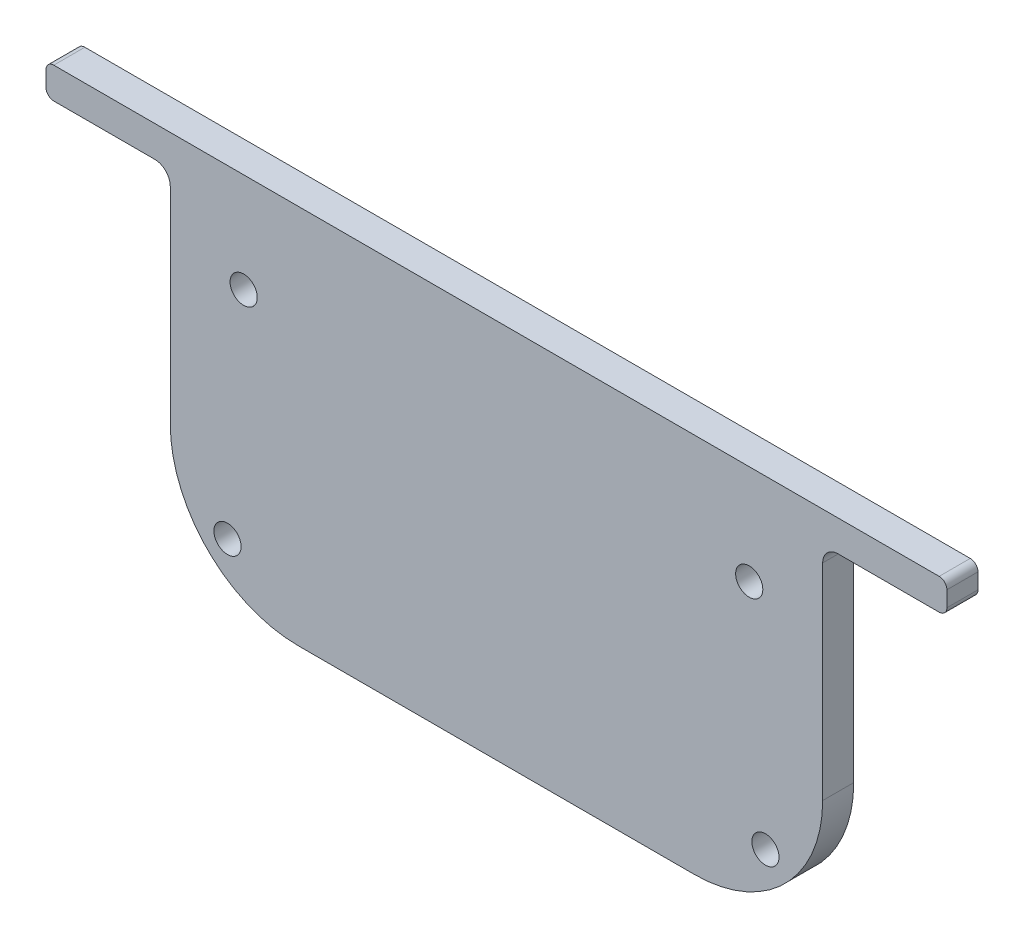
ISO-10303-21;
HEADER;
FILE_DESCRIPTION(('STEP AP214'),'2;1');
FILE_NAME('part.step','',(''),(''),'','','');
FILE_SCHEMA(('AUTOMOTIVE_DESIGN { 1 0 10303 214 1 1 1 1 }'));
ENDSEC;
DATA;
#1=APPLICATION_CONTEXT('core data for automotive mechanical design processes');
#2=APPLICATION_PROTOCOL_DEFINITION('international standard','automotive_design',2000,#1);
#3=PRODUCT_CONTEXT('',#1,'mechanical');
#4=PRODUCT('Part','Part','',(#3));
#5=PRODUCT_RELATED_PRODUCT_CATEGORY('part','',(#4));
#6=PRODUCT_DEFINITION_FORMATION('','',#4);
#7=PRODUCT_DEFINITION_CONTEXT('part definition',#1,'design');
#8=PRODUCT_DEFINITION('design','',#6,#7);
#9=PRODUCT_DEFINITION_SHAPE('','',#8);
#10=(LENGTH_UNIT() NAMED_UNIT(*) SI_UNIT(.MILLI.,.METRE.));
#11=(NAMED_UNIT(*) PLANE_ANGLE_UNIT() SI_UNIT($,.RADIAN.));
#12=(NAMED_UNIT(*) SI_UNIT($,.STERADIAN.) SOLID_ANGLE_UNIT());
#13=UNCERTAINTY_MEASURE_WITH_UNIT(LENGTH_MEASURE(1.E-05),#10,'distance_accuracy_value','');
#14=(GEOMETRIC_REPRESENTATION_CONTEXT(3) GLOBAL_UNCERTAINTY_ASSIGNED_CONTEXT((#13)) GLOBAL_UNIT_ASSIGNED_CONTEXT((#10,
#11,#12)) REPRESENTATION_CONTEXT('',''));
#15=CARTESIAN_POINT('',(0.,0.,0.));
#16=DIRECTION('',(0.,0.,1.));
#17=DIRECTION('',(1.,0.,0.));
#18=AXIS2_PLACEMENT_3D('',#15,#16,#17);
#19=CARTESIAN_POINT('',(165.580085469518,47.7956590481423,4.));
#20=DIRECTION('',(0.,0.,1.));
#21=DIRECTION('',(1.,0.,0.));
#22=AXIS2_PLACEMENT_3D('',#19,#20,#21);
#23=PLANE('',#22);
#24=CARTESIAN_POINT('',(154.122585469516,40.9879638935542,4.));
#25=DIRECTION('',(0.,0.,1.));
#26=DIRECTION('',(1.,0.,0.));
#27=AXIS2_PLACEMENT_3D('',#24,#25,#26);
#28=CIRCLE('',#27,1.75);
#29=CARTESIAN_POINT('',(155.872585469516,40.9879638935542,4.));
#30=VERTEX_POINT('',#29);
#31=EDGE_CURVE('E343',#30,#30,#28,.T.);
#32=ORIENTED_EDGE('',*,*,#31,.F.);
#33=EDGE_LOOP('',(#32));
#34=FACE_BOUND('',#33,.T.);
#35=CARTESIAN_POINT('',(89.0300854695157,40.9879638935542,4.));
#36=DIRECTION('',(0.,0.,1.));
#37=DIRECTION('',(1.,0.,0.));
#38=AXIS2_PLACEMENT_3D('',#35,#36,#37);
#39=CIRCLE('',#38,1.75);
#40=CARTESIAN_POINT('',(90.7800854695157,40.9879638935542,4.));
#41=VERTEX_POINT('',#40);
#42=EDGE_CURVE('E182',#41,#41,#39,.T.);
#43=ORIENTED_EDGE('',*,*,#42,.F.);
#44=EDGE_LOOP('',(#43));
#45=FACE_BOUND('',#44,.T.);
#46=CARTESIAN_POINT('',(165.580085469518,47.7956590481423,4.));
#47=DIRECTION('',(0.,0.,-1.));
#48=DIRECTION('',(1.,0.,0.));
#49=AXIS2_PLACEMENT_3D('',#46,#47,#48);
#50=CIRCLE('',#49,2.);
#51=CARTESIAN_POINT('',(163.580085469518,47.7956590481423,4.));
#52=VERTEX_POINT('',#51);
#53=CARTESIAN_POINT('',(165.580085469518,49.7956590481423,4.));
#54=VERTEX_POINT('',#53);
#55=EDGE_CURVE('E209',#52,#54,#50,.T.);
#56=ORIENTED_EDGE('',*,*,#55,.T.);
#57=DIRECTION('',(1.,0.,0.));
#58=VECTOR('',#57,1.);
#59=CARTESIAN_POINT('',(165.580085469518,49.7956590481423,4.));
#60=LINE('',#59,#58);
#61=CARTESIAN_POINT('',(178.580085469518,49.7956590481423,4.));
#62=VERTEX_POINT('',#61);
#63=EDGE_CURVE('E117',#54,#62,#60,.T.);
#64=ORIENTED_EDGE('',*,*,#63,.T.);
#65=CARTESIAN_POINT('',(178.580085469518,50.7956590481423,4.));
#66=DIRECTION('',(0.,0.,1.));
#67=DIRECTION('',(1.,0.,0.));
#68=AXIS2_PLACEMENT_3D('',#65,#66,#67);
#69=CIRCLE('',#68,1.);
#70=CARTESIAN_POINT('',(179.580085469518,50.7956590481423,4.));
#71=VERTEX_POINT('',#70);
#72=EDGE_CURVE('E248',#62,#71,#69,.T.);
#73=ORIENTED_EDGE('',*,*,#72,.T.);
#74=DIRECTION('',(0.,1.,0.));
#75=VECTOR('',#74,1.);
#76=CARTESIAN_POINT('',(179.580085469518,50.7956590481423,4.));
#77=LINE('',#76,#75);
#78=CARTESIAN_POINT('',(179.580085469518,52.7956590481423,4.));
#79=VERTEX_POINT('',#78);
#80=EDGE_CURVE('E267',#71,#79,#77,.T.);
#81=ORIENTED_EDGE('',*,*,#80,.T.);
#82=CARTESIAN_POINT('',(178.580085469518,52.7956590481423,4.));
#83=DIRECTION('',(0.,0.,1.));
#84=DIRECTION('',(1.,0.,0.));
#85=AXIS2_PLACEMENT_3D('',#82,#83,#84);
#86=CIRCLE('',#85,1.);
#87=CARTESIAN_POINT('',(178.580085469518,53.7956590481423,4.));
#88=VERTEX_POINT('',#87);
#89=EDGE_CURVE('E264',#79,#88,#86,.T.);
#90=ORIENTED_EDGE('',*,*,#89,.T.);
#91=DIRECTION('',(-1.,0.,0.));
#92=VECTOR('',#91,1.);
#93=CARTESIAN_POINT('',(178.580085469518,53.7956590481423,4.));
#94=LINE('',#93,#92);
#95=CARTESIAN_POINT('',(64.5800854695175,53.7956590481423,4.));
#96=VERTEX_POINT('',#95);
#97=EDGE_CURVE('E266',#88,#96,#94,.T.);
#98=ORIENTED_EDGE('',*,*,#97,.T.);
#99=CARTESIAN_POINT('',(64.5800854695175,52.7956590481423,4.));
#100=DIRECTION('',(0.,0.,1.));
#101=DIRECTION('',(1.,0.,0.));
#102=AXIS2_PLACEMENT_3D('',#99,#100,#101);
#103=CIRCLE('',#102,1.);
#104=CARTESIAN_POINT('',(63.5800854695175,52.7956590481423,4.));
#105=VERTEX_POINT('',#104);
#106=EDGE_CURVE('E269',#96,#105,#103,.T.);
#107=ORIENTED_EDGE('',*,*,#106,.T.);
#108=DIRECTION('',(0.,-1.,0.));
#109=VECTOR('',#108,1.);
#110=CARTESIAN_POINT('',(63.5800854695175,50.7956590481423,4.));
#111=LINE('',#110,#109);
#112=CARTESIAN_POINT('',(63.5800854695175,50.7956590481423,4.));
#113=VERTEX_POINT('',#112);
#114=EDGE_CURVE('E275',#105,#113,#111,.T.);
#115=ORIENTED_EDGE('',*,*,#114,.T.);
#116=CARTESIAN_POINT('',(64.5800854695175,50.7956590481423,4.));
#117=DIRECTION('',(0.,0.,1.));
#118=DIRECTION('',(1.,0.,0.));
#119=AXIS2_PLACEMENT_3D('',#116,#117,#118);
#120=CIRCLE('',#119,1.);
#121=CARTESIAN_POINT('',(64.5800854695175,49.7956590481423,4.));
#122=VERTEX_POINT('',#121);
#123=EDGE_CURVE('E277',#113,#122,#120,.T.);
#124=ORIENTED_EDGE('',*,*,#123,.T.);
#125=DIRECTION('',(1.,0.,0.));
#126=VECTOR('',#125,1.);
#127=CARTESIAN_POINT('',(77.5800854695175,49.7956590481423,4.));
#128=LINE('',#127,#126);
#129=CARTESIAN_POINT('',(77.5800854695175,49.7956590481423,4.));
#130=VERTEX_POINT('',#129);
#131=EDGE_CURVE('E279',#122,#130,#128,.T.);
#132=ORIENTED_EDGE('',*,*,#131,.T.);
#133=CARTESIAN_POINT('',(77.5800854695175,47.7956590481423,4.));
#134=DIRECTION('',(0.,0.,-1.));
#135=DIRECTION('',(1.,0.,0.));
#136=AXIS2_PLACEMENT_3D('',#133,#134,#135);
#137=CIRCLE('',#136,2.);
#138=CARTESIAN_POINT('',(79.5800854695175,47.7956590481423,4.));
#139=VERTEX_POINT('',#138);
#140=EDGE_CURVE('E281',#130,#139,#137,.T.);
#141=ORIENTED_EDGE('',*,*,#140,.T.);
#142=DIRECTION('',(0.,-1.,0.));
#143=VECTOR('',#142,1.);
#144=CARTESIAN_POINT('',(79.5800854695175,47.7956590481423,4.));
#145=LINE('',#144,#143);
#146=CARTESIAN_POINT('',(79.5800854695175,21.2956590481424,4.));
#147=VERTEX_POINT('',#146);
#148=EDGE_CURVE('E283',#139,#147,#145,.T.);
#149=ORIENTED_EDGE('',*,*,#148,.T.);
#150=CARTESIAN_POINT('',(96.0800854695175,21.2956590481424,4.));
#151=DIRECTION('',(0.,0.,1.));
#152=DIRECTION('',(1.,0.,0.));
#153=AXIS2_PLACEMENT_3D('',#150,#151,#152);
#154=CIRCLE('',#153,16.5);
#155=CARTESIAN_POINT('',(96.0800854695175,4.79565904814235,4.));
#156=VERTEX_POINT('',#155);
#157=EDGE_CURVE('E160',#147,#156,#154,.T.);
#158=ORIENTED_EDGE('',*,*,#157,.T.);
#159=DIRECTION('',(1.,0.,0.));
#160=VECTOR('',#159,1.);
#161=CARTESIAN_POINT('',(96.0800854695175,4.79565904814235,4.));
#162=LINE('',#161,#160);
#163=CARTESIAN_POINT('',(147.080085469518,4.7956590481423,4.));
#164=VERTEX_POINT('',#163);
#165=EDGE_CURVE('E154',#156,#164,#162,.T.);
#166=ORIENTED_EDGE('',*,*,#165,.T.);
#167=CARTESIAN_POINT('',(147.080085469518,21.2956590481423,4.));
#168=DIRECTION('',(0.,0.,1.));
#169=DIRECTION('',(1.,0.,0.));
#170=AXIS2_PLACEMENT_3D('',#167,#168,#169);
#171=CIRCLE('',#170,16.5);
#172=CARTESIAN_POINT('',(163.580085469518,21.2956590481423,4.));
#173=VERTEX_POINT('',#172);
#174=EDGE_CURVE('E158',#164,#173,#171,.T.);
#175=ORIENTED_EDGE('',*,*,#174,.T.);
#176=DIRECTION('',(0.,1.,0.));
#177=VECTOR('',#176,1.);
#178=CARTESIAN_POINT('',(163.580085469518,21.2956590481423,4.));
#179=LINE('',#178,#177);
#180=EDGE_CURVE('E50',#173,#52,#179,.T.);
#181=ORIENTED_EDGE('',*,*,#180,.T.);
#182=EDGE_LOOP('',(#56,#64,#73,#81,#90,#98,#107,#115,#124,#132,#141,#149,#158,#166,#175,#181));
#183=FACE_BOUND('',#182,.T.);
#184=CARTESIAN_POINT('',(86.9464545247285,12.1620281033534,4.));
#185=DIRECTION('',(0.,0.,1.));
#186=DIRECTION('',(1.,0.,0.));
#187=AXIS2_PLACEMENT_3D('',#184,#185,#186);
#188=CIRCLE('',#187,1.75);
#189=CARTESIAN_POINT('',(88.6964545247285,12.1620281033534,4.));
#190=VERTEX_POINT('',#189);
#191=EDGE_CURVE('E349',#190,#190,#188,.T.);
#192=ORIENTED_EDGE('',*,*,#191,.F.);
#193=EDGE_LOOP('',(#192));
#194=FACE_BOUND('',#193,.T.);
#195=CARTESIAN_POINT('',(156.213716414307,12.1620281033533,4.));
#196=DIRECTION('',(0.,0.,1.));
#197=DIRECTION('',(1.,0.,0.));
#198=AXIS2_PLACEMENT_3D('',#195,#196,#197);
#199=CIRCLE('',#198,1.75);
#200=CARTESIAN_POINT('',(157.963716414307,12.1620281033533,4.));
#201=VERTEX_POINT('',#200);
#202=EDGE_CURVE('E334',#201,#201,#199,.T.);
#203=ORIENTED_EDGE('',*,*,#202,.F.);
#204=EDGE_LOOP('',(#203));
#205=FACE_BOUND('',#204,.T.);
#206=ADVANCED_FACE('F33',(#34,#45,#183,#194,#205),#23,.T.);
#207=CARTESIAN_POINT('',(165.580085469518,47.7956590481423,0.));
#208=DIRECTION('',(0.,0.,1.));
#209=DIRECTION('',(1.,0.,0.));
#210=AXIS2_PLACEMENT_3D('',#207,#208,#209);
#211=PLANE('',#210);
#212=CARTESIAN_POINT('',(165.580085469518,47.7956590481423,0.));
#213=DIRECTION('',(0.,0.,-1.));
#214=DIRECTION('',(1.,0.,0.));
#215=AXIS2_PLACEMENT_3D('',#212,#213,#214);
#216=CIRCLE('',#215,2.);
#217=CARTESIAN_POINT('',(163.580085469518,47.7956590481423,0.));
#218=VERTEX_POINT('',#217);
#219=CARTESIAN_POINT('',(165.580085469518,49.7956590481423,0.));
#220=VERTEX_POINT('',#219);
#221=EDGE_CURVE('E178',#218,#220,#216,.T.);
#222=ORIENTED_EDGE('',*,*,#221,.F.);
#223=DIRECTION('',(0.,1.,0.));
#224=VECTOR('',#223,1.);
#225=CARTESIAN_POINT('',(163.580085469518,21.2956590481423,0.));
#226=LINE('',#225,#224);
#227=CARTESIAN_POINT('',(163.580085469518,21.2956590481423,0.));
#228=VERTEX_POINT('',#227);
#229=EDGE_CURVE('E109',#228,#218,#226,.T.);
#230=ORIENTED_EDGE('',*,*,#229,.F.);
#231=CARTESIAN_POINT('',(147.080085469518,21.2956590481423,0.));
#232=DIRECTION('',(0.,0.,1.));
#233=DIRECTION('',(1.,0.,0.));
#234=AXIS2_PLACEMENT_3D('',#231,#232,#233);
#235=CIRCLE('',#234,16.5);
#236=CARTESIAN_POINT('',(147.080085469518,4.7956590481423,0.));
#237=VERTEX_POINT('',#236);
#238=EDGE_CURVE('E103',#237,#228,#235,.T.);
#239=ORIENTED_EDGE('',*,*,#238,.F.);
#240=DIRECTION('',(1.,0.,0.));
#241=VECTOR('',#240,1.);
#242=CARTESIAN_POINT('',(96.0800854695175,4.79565904814235,0.));
#243=LINE('',#242,#241);
#244=CARTESIAN_POINT('',(96.0800854695175,4.79565904814235,0.));
#245=VERTEX_POINT('',#244);
#246=EDGE_CURVE('E168',#245,#237,#243,.T.);
#247=ORIENTED_EDGE('',*,*,#246,.F.);
#248=CARTESIAN_POINT('',(96.0800854695175,21.2956590481424,0.));
#249=DIRECTION('',(0.,0.,1.));
#250=DIRECTION('',(1.,0.,0.));
#251=AXIS2_PLACEMENT_3D('',#248,#249,#250);
#252=CIRCLE('',#251,16.5);
#253=CARTESIAN_POINT('',(79.5800854695175,21.2956590481424,0.));
#254=VERTEX_POINT('',#253);
#255=EDGE_CURVE('E204',#254,#245,#252,.T.);
#256=ORIENTED_EDGE('',*,*,#255,.F.);
#257=DIRECTION('',(0.,-1.,0.));
#258=VECTOR('',#257,1.);
#259=CARTESIAN_POINT('',(79.5800854695175,47.7956590481423,0.));
#260=LINE('',#259,#258);
#261=CARTESIAN_POINT('',(79.5800854695175,47.7956590481423,0.));
#262=VERTEX_POINT('',#261);
#263=EDGE_CURVE('E202',#262,#254,#260,.T.);
#264=ORIENTED_EDGE('',*,*,#263,.F.);
#265=CARTESIAN_POINT('',(77.5800854695175,47.7956590481423,0.));
#266=DIRECTION('',(0.,0.,-1.));
#267=DIRECTION('',(1.,0.,0.));
#268=AXIS2_PLACEMENT_3D('',#265,#266,#267);
#269=CIRCLE('',#268,2.);
#270=CARTESIAN_POINT('',(77.5800854695175,49.7956590481423,0.));
#271=VERTEX_POINT('',#270);
#272=EDGE_CURVE('E200',#271,#262,#269,.T.);
#273=ORIENTED_EDGE('',*,*,#272,.F.);
#274=DIRECTION('',(1.,0.,0.));
#275=VECTOR('',#274,1.);
#276=CARTESIAN_POINT('',(77.5800854695175,49.7956590481423,0.));
#277=LINE('',#276,#275);
#278=CARTESIAN_POINT('',(64.5800854695175,49.7956590481423,0.));
#279=VERTEX_POINT('',#278);
#280=EDGE_CURVE('E198',#279,#271,#277,.T.);
#281=ORIENTED_EDGE('',*,*,#280,.F.);
#282=CARTESIAN_POINT('',(64.5800854695175,50.7956590481423,0.));
#283=DIRECTION('',(0.,0.,1.));
#284=DIRECTION('',(1.,0.,0.));
#285=AXIS2_PLACEMENT_3D('',#282,#283,#284);
#286=CIRCLE('',#285,1.);
#287=CARTESIAN_POINT('',(63.5800854695175,50.7956590481423,0.));
#288=VERTEX_POINT('',#287);
#289=EDGE_CURVE('E196',#288,#279,#286,.T.);
#290=ORIENTED_EDGE('',*,*,#289,.F.);
#291=DIRECTION('',(0.,-1.,0.));
#292=VECTOR('',#291,1.);
#293=CARTESIAN_POINT('',(63.5800854695175,50.7956590481423,0.));
#294=LINE('',#293,#292);
#295=CARTESIAN_POINT('',(63.5800854695175,52.7956590481423,0.));
#296=VERTEX_POINT('',#295);
#297=EDGE_CURVE('E194',#296,#288,#294,.T.);
#298=ORIENTED_EDGE('',*,*,#297,.F.);
#299=CARTESIAN_POINT('',(64.5800854695175,52.7956590481423,0.));
#300=DIRECTION('',(0.,0.,1.));
#301=DIRECTION('',(1.,0.,0.));
#302=AXIS2_PLACEMENT_3D('',#299,#300,#301);
#303=CIRCLE('',#302,1.);
#304=CARTESIAN_POINT('',(64.5800854695175,53.7956590481423,0.));
#305=VERTEX_POINT('',#304);
#306=EDGE_CURVE('E192',#305,#296,#303,.T.);
#307=ORIENTED_EDGE('',*,*,#306,.F.);
#308=DIRECTION('',(-1.,0.,0.));
#309=VECTOR('',#308,1.);
#310=CARTESIAN_POINT('',(178.580085469518,53.7956590481423,0.));
#311=LINE('',#310,#309);
#312=CARTESIAN_POINT('',(178.580085469518,53.7956590481423,0.));
#313=VERTEX_POINT('',#312);
#314=EDGE_CURVE('E190',#313,#305,#311,.T.);
#315=ORIENTED_EDGE('',*,*,#314,.F.);
#316=CARTESIAN_POINT('',(178.580085469518,52.7956590481423,0.));
#317=DIRECTION('',(0.,0.,1.));
#318=DIRECTION('',(1.,0.,0.));
#319=AXIS2_PLACEMENT_3D('',#316,#317,#318);
#320=CIRCLE('',#319,1.);
#321=CARTESIAN_POINT('',(179.580085469518,52.7956590481423,0.));
#322=VERTEX_POINT('',#321);
#323=EDGE_CURVE('E188',#322,#313,#320,.T.);
#324=ORIENTED_EDGE('',*,*,#323,.F.);
#325=DIRECTION('',(0.,1.,0.));
#326=VECTOR('',#325,1.);
#327=CARTESIAN_POINT('',(179.580085469518,50.7956590481423,0.));
#328=LINE('',#327,#326);
#329=CARTESIAN_POINT('',(179.580085469518,50.7956590481423,0.));
#330=VERTEX_POINT('',#329);
#331=EDGE_CURVE('E186',#330,#322,#328,.T.);
#332=ORIENTED_EDGE('',*,*,#331,.F.);
#333=CARTESIAN_POINT('',(178.580085469518,50.7956590481423,0.));
#334=DIRECTION('',(0.,0.,1.));
#335=DIRECTION('',(1.,0.,0.));
#336=AXIS2_PLACEMENT_3D('',#333,#334,#335);
#337=CIRCLE('',#336,1.);
#338=CARTESIAN_POINT('',(178.580085469518,49.7956590481423,0.));
#339=VERTEX_POINT('',#338);
#340=EDGE_CURVE('E184',#339,#330,#337,.T.);
#341=ORIENTED_EDGE('',*,*,#340,.F.);
#342=DIRECTION('',(1.,0.,0.));
#343=VECTOR('',#342,1.);
#344=CARTESIAN_POINT('',(165.580085469518,49.7956590481423,0.));
#345=LINE('',#344,#343);
#346=EDGE_CURVE('E181',#220,#339,#345,.T.);
#347=ORIENTED_EDGE('',*,*,#346,.F.);
#348=EDGE_LOOP('',(#222,#230,#239,#247,#256,#264,#273,#281,#290,#298,#307,#315,#324,#332,#341,#347));
#349=FACE_BOUND('',#348,.T.);
#350=CARTESIAN_POINT('',(89.0300854695157,40.9879638935542,0.));
#351=DIRECTION('',(0.,0.,1.));
#352=DIRECTION('',(1.,0.,0.));
#353=AXIS2_PLACEMENT_3D('',#350,#351,#352);
#354=CIRCLE('',#353,1.75);
#355=CARTESIAN_POINT('',(90.7800854695157,40.9879638935542,0.));
#356=VERTEX_POINT('',#355);
#357=EDGE_CURVE('E352',#356,#356,#354,.T.);
#358=ORIENTED_EDGE('',*,*,#357,.T.);
#359=EDGE_LOOP('',(#358));
#360=FACE_BOUND('',#359,.T.);
#361=CARTESIAN_POINT('',(86.9464545247285,12.1620281033534,0.));
#362=DIRECTION('',(0.,0.,1.));
#363=DIRECTION('',(1.,0.,0.));
#364=AXIS2_PLACEMENT_3D('',#361,#362,#363);
#365=CIRCLE('',#364,1.75);
#366=CARTESIAN_POINT('',(88.6964545247285,12.1620281033534,0.));
#367=VERTEX_POINT('',#366);
#368=EDGE_CURVE('E346',#367,#367,#365,.T.);
#369=ORIENTED_EDGE('',*,*,#368,.T.);
#370=EDGE_LOOP('',(#369));
#371=FACE_BOUND('',#370,.T.);
#372=CARTESIAN_POINT('',(154.122585469516,40.9879638935542,0.));
#373=DIRECTION('',(0.,0.,1.));
#374=DIRECTION('',(1.,0.,0.));
#375=AXIS2_PLACEMENT_3D('',#372,#373,#374);
#376=CIRCLE('',#375,1.75);
#377=CARTESIAN_POINT('',(155.872585469516,40.9879638935542,0.));
#378=VERTEX_POINT('',#377);
#379=EDGE_CURVE('E340',#378,#378,#376,.T.);
#380=ORIENTED_EDGE('',*,*,#379,.T.);
#381=EDGE_LOOP('',(#380));
#382=FACE_BOUND('',#381,.T.);
#383=CARTESIAN_POINT('',(156.213716414307,12.1620281033533,0.));
#384=DIRECTION('',(0.,0.,1.));
#385=DIRECTION('',(1.,0.,0.));
#386=AXIS2_PLACEMENT_3D('',#383,#384,#385);
#387=CIRCLE('',#386,1.75);
#388=CARTESIAN_POINT('',(157.963716414307,12.1620281033533,0.));
#389=VERTEX_POINT('',#388);
#390=EDGE_CURVE('E337',#389,#389,#387,.T.);
#391=ORIENTED_EDGE('',*,*,#390,.T.);
#392=EDGE_LOOP('',(#391));
#393=FACE_BOUND('',#392,.T.);
#394=ADVANCED_FACE('F252',(#349,#360,#371,#382,#393),#211,.F.);
#395=CARTESIAN_POINT('',(165.580085469518,47.7956590481423,4.));
#396=DIRECTION('',(0.,0.,-1.));
#397=DIRECTION('',(-1.,0.,0.));
#398=AXIS2_PLACEMENT_3D('',#395,#396,#397);
#399=CYLINDRICAL_SURFACE('',#398,2.);
#400=ORIENTED_EDGE('',*,*,#221,.T.);
#401=DIRECTION('',(0.,0.,-1.));
#402=VECTOR('',#401,1.);
#403=CARTESIAN_POINT('',(165.580085469518,49.7956590481423,4.));
#404=LINE('',#403,#402);
#405=EDGE_CURVE('E11',#54,#220,#404,.T.);
#406=ORIENTED_EDGE('',*,*,#405,.F.);
#407=ORIENTED_EDGE('',*,*,#55,.F.);
#408=DIRECTION('',(0.,0.,-1.));
#409=VECTOR('',#408,1.);
#410=CARTESIAN_POINT('',(163.580085469518,47.7956590481423,4.));
#411=LINE('',#410,#409);
#412=EDGE_CURVE('E174',#52,#218,#411,.T.);
#413=ORIENTED_EDGE('',*,*,#412,.T.);
#414=EDGE_LOOP('',(#400,#406,#407,#413));
#415=FACE_BOUND('',#414,.T.);
#416=ADVANCED_FACE('F35',(#415),#399,.F.);
#417=CARTESIAN_POINT('',(165.580085469518,49.7956590481423,4.));
#418=DIRECTION('',(0.,1.,0.));
#419=DIRECTION('',(0.,0.,1.));
#420=AXIS2_PLACEMENT_3D('',#417,#418,#419);
#421=PLANE('',#420);
#422=ORIENTED_EDGE('',*,*,#346,.T.);
#423=DIRECTION('',(0.,0.,-1.));
#424=VECTOR('',#423,1.);
#425=CARTESIAN_POINT('',(178.580085469518,49.7956590481423,4.));
#426=LINE('',#425,#424);
#427=EDGE_CURVE('E42',#62,#339,#426,.T.);
#428=ORIENTED_EDGE('',*,*,#427,.F.);
#429=ORIENTED_EDGE('',*,*,#63,.F.);
#430=ORIENTED_EDGE('',*,*,#405,.T.);
#431=EDGE_LOOP('',(#422,#428,#429,#430));
#432=FACE_BOUND('',#431,.T.);
#433=ADVANCED_FACE('F502',(#432),#421,.F.);
#434=CARTESIAN_POINT('',(178.580085469518,50.7956590481423,4.));
#435=DIRECTION('',(0.,0.,-1.));
#436=DIRECTION('',(-1.,0.,0.));
#437=AXIS2_PLACEMENT_3D('',#434,#435,#436);
#438=CYLINDRICAL_SURFACE('',#437,1.);
#439=ORIENTED_EDGE('',*,*,#340,.T.);
#440=DIRECTION('',(0.,0.,-1.));
#441=VECTOR('',#440,1.);
#442=CARTESIAN_POINT('',(179.580085469518,50.7956590481423,4.));
#443=LINE('',#442,#441);
#444=EDGE_CURVE('E240',#71,#330,#443,.T.);
#445=ORIENTED_EDGE('',*,*,#444,.F.);
#446=ORIENTED_EDGE('',*,*,#72,.F.);
#447=ORIENTED_EDGE('',*,*,#427,.T.);
#448=EDGE_LOOP('',(#439,#445,#446,#447));
#449=FACE_BOUND('',#448,.T.);
#450=ADVANCED_FACE('F246',(#449),#438,.T.);
#451=CARTESIAN_POINT('',(179.580085469518,50.7956590481423,4.));
#452=DIRECTION('',(-1.,0.,0.));
#453=DIRECTION('',(0.,0.,1.));
#454=AXIS2_PLACEMENT_3D('',#451,#452,#453);
#455=PLANE('',#454);
#456=ORIENTED_EDGE('',*,*,#331,.T.);
#457=DIRECTION('',(0.,0.,-1.));
#458=VECTOR('',#457,1.);
#459=CARTESIAN_POINT('',(179.580085469518,52.7956590481423,4.));
#460=LINE('',#459,#458);
#461=EDGE_CURVE('E237',#79,#322,#460,.T.);
#462=ORIENTED_EDGE('',*,*,#461,.F.);
#463=ORIENTED_EDGE('',*,*,#80,.F.);
#464=ORIENTED_EDGE('',*,*,#444,.T.);
#465=EDGE_LOOP('',(#456,#462,#463,#464));
#466=FACE_BOUND('',#465,.T.);
#467=ADVANCED_FACE('F258',(#466),#455,.F.);
#468=CARTESIAN_POINT('',(178.580085469518,52.7956590481423,4.));
#469=DIRECTION('',(0.,0.,-1.));
#470=DIRECTION('',(-1.,0.,0.));
#471=AXIS2_PLACEMENT_3D('',#468,#469,#470);
#472=CYLINDRICAL_SURFACE('',#471,1.);
#473=ORIENTED_EDGE('',*,*,#323,.T.);
#474=DIRECTION('',(0.,0.,-1.));
#475=VECTOR('',#474,1.);
#476=CARTESIAN_POINT('',(178.580085469518,53.7956590481423,4.));
#477=LINE('',#476,#475);
#478=EDGE_CURVE('E234',#88,#313,#477,.T.);
#479=ORIENTED_EDGE('',*,*,#478,.F.);
#480=ORIENTED_EDGE('',*,*,#89,.F.);
#481=ORIENTED_EDGE('',*,*,#461,.T.);
#482=EDGE_LOOP('',(#473,#479,#480,#481));
#483=FACE_BOUND('',#482,.T.);
#484=ADVANCED_FACE('F262',(#483),#472,.T.);
#485=CARTESIAN_POINT('',(178.580085469518,53.7956590481423,4.));
#486=DIRECTION('',(0.,-1.,0.));
#487=DIRECTION('',(1.,0.,0.));
#488=AXIS2_PLACEMENT_3D('',#485,#486,#487);
#489=PLANE('',#488);
#490=ORIENTED_EDGE('',*,*,#314,.T.);
#491=DIRECTION('',(0.,0.,-1.));
#492=VECTOR('',#491,1.);
#493=CARTESIAN_POINT('',(64.5800854695175,53.7956590481423,4.));
#494=LINE('',#493,#492);
#495=EDGE_CURVE('E231',#96,#305,#494,.T.);
#496=ORIENTED_EDGE('',*,*,#495,.F.);
#497=ORIENTED_EDGE('',*,*,#97,.F.);
#498=ORIENTED_EDGE('',*,*,#478,.T.);
#499=EDGE_LOOP('',(#490,#496,#497,#498));
#500=FACE_BOUND('',#499,.T.);
#501=ADVANCED_FACE('F467',(#500),#489,.F.);
#502=CARTESIAN_POINT('',(64.5800854695175,52.7956590481423,4.));
#503=DIRECTION('',(0.,0.,-1.));
#504=DIRECTION('',(-1.,0.,0.));
#505=AXIS2_PLACEMENT_3D('',#502,#503,#504);
#506=CYLINDRICAL_SURFACE('',#505,1.);
#507=ORIENTED_EDGE('',*,*,#306,.T.);
#508=DIRECTION('',(0.,0.,-1.));
#509=VECTOR('',#508,1.);
#510=CARTESIAN_POINT('',(63.5800854695175,52.7956590481423,4.));
#511=LINE('',#510,#509);
#512=EDGE_CURVE('E228',#105,#296,#511,.T.);
#513=ORIENTED_EDGE('',*,*,#512,.F.);
#514=ORIENTED_EDGE('',*,*,#106,.F.);
#515=ORIENTED_EDGE('',*,*,#495,.T.);
#516=EDGE_LOOP('',(#507,#513,#514,#515));
#517=FACE_BOUND('',#516,.T.);
#518=ADVANCED_FACE('F457',(#517),#506,.T.);
#519=CARTESIAN_POINT('',(63.5800854695175,50.7956590481423,4.));
#520=DIRECTION('',(1.,0.,0.));
#521=DIRECTION('',(0.,0.,-1.));
#522=AXIS2_PLACEMENT_3D('',#519,#520,#521);
#523=PLANE('',#522);
#524=ORIENTED_EDGE('',*,*,#297,.T.);
#525=DIRECTION('',(0.,0.,-1.));
#526=VECTOR('',#525,1.);
#527=CARTESIAN_POINT('',(63.5800854695175,50.7956590481423,4.));
#528=LINE('',#527,#526);
#529=EDGE_CURVE('E225',#113,#288,#528,.T.);
#530=ORIENTED_EDGE('',*,*,#529,.F.);
#531=ORIENTED_EDGE('',*,*,#114,.F.);
#532=ORIENTED_EDGE('',*,*,#512,.T.);
#533=EDGE_LOOP('',(#524,#530,#531,#532));
#534=FACE_BOUND('',#533,.T.);
#535=ADVANCED_FACE('F447',(#534),#523,.F.);
#536=CARTESIAN_POINT('',(64.5800854695175,50.7956590481423,4.));
#537=DIRECTION('',(0.,0.,-1.));
#538=DIRECTION('',(-1.,0.,0.));
#539=AXIS2_PLACEMENT_3D('',#536,#537,#538);
#540=CYLINDRICAL_SURFACE('',#539,1.);
#541=ORIENTED_EDGE('',*,*,#289,.T.);
#542=DIRECTION('',(0.,0.,-1.));
#543=VECTOR('',#542,1.);
#544=CARTESIAN_POINT('',(64.5800854695175,49.7956590481423,4.));
#545=LINE('',#544,#543);
#546=EDGE_CURVE('E222',#122,#279,#545,.T.);
#547=ORIENTED_EDGE('',*,*,#546,.F.);
#548=ORIENTED_EDGE('',*,*,#123,.F.);
#549=ORIENTED_EDGE('',*,*,#529,.T.);
#550=EDGE_LOOP('',(#541,#547,#548,#549));
#551=FACE_BOUND('',#550,.T.);
#552=ADVANCED_FACE('F437',(#551),#540,.T.);
#553=CARTESIAN_POINT('',(77.5800854695175,49.7956590481423,4.));
#554=DIRECTION('',(0.,1.,0.));
#555=DIRECTION('',(0.,0.,1.));
#556=AXIS2_PLACEMENT_3D('',#553,#554,#555);
#557=PLANE('',#556);
#558=ORIENTED_EDGE('',*,*,#280,.T.);
#559=DIRECTION('',(0.,0.,-1.));
#560=VECTOR('',#559,1.);
#561=CARTESIAN_POINT('',(77.5800854695175,49.7956590481423,4.));
#562=LINE('',#561,#560);
#563=EDGE_CURVE('E219',#130,#271,#562,.T.);
#564=ORIENTED_EDGE('',*,*,#563,.F.);
#565=ORIENTED_EDGE('',*,*,#131,.F.);
#566=ORIENTED_EDGE('',*,*,#546,.T.);
#567=EDGE_LOOP('',(#558,#564,#565,#566));
#568=FACE_BOUND('',#567,.T.);
#569=ADVANCED_FACE('F427',(#568),#557,.F.);
#570=CARTESIAN_POINT('',(77.5800854695175,47.7956590481423,4.));
#571=DIRECTION('',(0.,0.,-1.));
#572=DIRECTION('',(-1.,0.,0.));
#573=AXIS2_PLACEMENT_3D('',#570,#571,#572);
#574=CYLINDRICAL_SURFACE('',#573,2.);
#575=ORIENTED_EDGE('',*,*,#272,.T.);
#576=DIRECTION('',(0.,0.,-1.));
#577=VECTOR('',#576,1.);
#578=CARTESIAN_POINT('',(79.5800854695175,47.7956590481423,4.));
#579=LINE('',#578,#577);
#580=EDGE_CURVE('E216',#139,#262,#579,.T.);
#581=ORIENTED_EDGE('',*,*,#580,.F.);
#582=ORIENTED_EDGE('',*,*,#140,.F.);
#583=ORIENTED_EDGE('',*,*,#563,.T.);
#584=EDGE_LOOP('',(#575,#581,#582,#583));
#585=FACE_BOUND('',#584,.T.);
#586=ADVANCED_FACE('F418',(#585),#574,.F.);
#587=CARTESIAN_POINT('',(79.5800854695175,47.7956590481423,4.));
#588=DIRECTION('',(1.,0.,0.));
#589=DIRECTION('',(0.,1.,0.));
#590=AXIS2_PLACEMENT_3D('',#587,#588,#589);
#591=PLANE('',#590);
#592=ORIENTED_EDGE('',*,*,#263,.T.);
#593=DIRECTION('',(0.,0.,-1.));
#594=VECTOR('',#593,1.);
#595=CARTESIAN_POINT('',(79.5800854695175,21.2956590481424,4.));
#596=LINE('',#595,#594);
#597=EDGE_CURVE('E213',#147,#254,#596,.T.);
#598=ORIENTED_EDGE('',*,*,#597,.F.);
#599=ORIENTED_EDGE('',*,*,#148,.F.);
#600=ORIENTED_EDGE('',*,*,#580,.T.);
#601=EDGE_LOOP('',(#592,#598,#599,#600));
#602=FACE_BOUND('',#601,.T.);
#603=ADVANCED_FACE('F289',(#602),#591,.F.);
#604=CARTESIAN_POINT('',(96.0800854695175,21.2956590481424,4.));
#605=DIRECTION('',(0.,0.,-1.));
#606=DIRECTION('',(-1.,0.,0.));
#607=AXIS2_PLACEMENT_3D('',#604,#605,#606);
#608=CYLINDRICAL_SURFACE('',#607,16.5);
#609=ORIENTED_EDGE('',*,*,#255,.T.);
#610=DIRECTION('',(0.,0.,-1.));
#611=VECTOR('',#610,1.);
#612=CARTESIAN_POINT('',(96.0800854695175,4.79565904814235,4.));
#613=LINE('',#612,#611);
#614=EDGE_CURVE('E169',#156,#245,#613,.T.);
#615=ORIENTED_EDGE('',*,*,#614,.F.);
#616=ORIENTED_EDGE('',*,*,#157,.F.);
#617=ORIENTED_EDGE('',*,*,#597,.T.);
#618=EDGE_LOOP('',(#609,#615,#616,#617));
#619=FACE_BOUND('',#618,.T.);
#620=ADVANCED_FACE('F293',(#619),#608,.T.);
#621=CARTESIAN_POINT('',(96.0800854695175,4.79565904814235,4.));
#622=DIRECTION('',(0.,1.,0.));
#623=DIRECTION('',(-1.,0.,0.));
#624=AXIS2_PLACEMENT_3D('',#621,#622,#623);
#625=PLANE('',#624);
#626=ORIENTED_EDGE('',*,*,#246,.T.);
#627=DIRECTION('',(0.,0.,-1.));
#628=VECTOR('',#627,1.);
#629=CARTESIAN_POINT('',(147.080085469518,4.7956590481423,4.));
#630=LINE('',#629,#628);
#631=EDGE_CURVE('E165',#164,#237,#630,.T.);
#632=ORIENTED_EDGE('',*,*,#631,.F.);
#633=ORIENTED_EDGE('',*,*,#165,.F.);
#634=ORIENTED_EDGE('',*,*,#614,.T.);
#635=EDGE_LOOP('',(#626,#632,#633,#634));
#636=FACE_BOUND('',#635,.T.);
#637=ADVANCED_FACE('F166',(#636),#625,.F.);
#638=CARTESIAN_POINT('',(147.080085469518,21.2956590481423,4.));
#639=DIRECTION('',(0.,0.,-1.));
#640=DIRECTION('',(-1.,0.,0.));
#641=AXIS2_PLACEMENT_3D('',#638,#639,#640);
#642=CYLINDRICAL_SURFACE('',#641,16.5);
#643=ORIENTED_EDGE('',*,*,#238,.T.);
#644=DIRECTION('',(0.,0.,-1.));
#645=VECTOR('',#644,1.);
#646=CARTESIAN_POINT('',(163.580085469518,21.2956590481423,4.));
#647=LINE('',#646,#645);
#648=EDGE_CURVE('E170',#173,#228,#647,.T.);
#649=ORIENTED_EDGE('',*,*,#648,.F.);
#650=ORIENTED_EDGE('',*,*,#174,.F.);
#651=ORIENTED_EDGE('',*,*,#631,.T.);
#652=EDGE_LOOP('',(#643,#649,#650,#651));
#653=FACE_BOUND('',#652,.T.);
#654=ADVANCED_FACE('F172',(#653),#642,.T.);
#655=CARTESIAN_POINT('',(163.580085469518,21.2956590481423,4.));
#656=DIRECTION('',(-1.,0.,0.));
#657=DIRECTION('',(0.,0.,1.));
#658=AXIS2_PLACEMENT_3D('',#655,#656,#657);
#659=PLANE('',#658);
#660=ORIENTED_EDGE('',*,*,#229,.T.);
#661=ORIENTED_EDGE('',*,*,#412,.F.);
#662=ORIENTED_EDGE('',*,*,#180,.F.);
#663=ORIENTED_EDGE('',*,*,#648,.T.);
#664=EDGE_LOOP('',(#660,#661,#662,#663));
#665=FACE_BOUND('',#664,.T.);
#666=ADVANCED_FACE('F297',(#665),#659,.F.);
#667=CARTESIAN_POINT('',(89.0300854695157,40.9879638935542,4.));
#668=DIRECTION('',(0.,0.,-1.));
#669=DIRECTION('',(-1.,0.,0.));
#670=AXIS2_PLACEMENT_3D('',#667,#668,#669);
#671=CYLINDRICAL_SURFACE('',#670,1.75);
#672=ORIENTED_EDGE('',*,*,#42,.T.);
#673=EDGE_LOOP('',(#672));
#674=FACE_BOUND('',#673,.T.);
#675=ORIENTED_EDGE('',*,*,#357,.F.);
#676=EDGE_LOOP('',(#675));
#677=FACE_BOUND('',#676,.T.);
#678=ADVANCED_FACE('F299',(#674,#677),#671,.F.);
#679=CARTESIAN_POINT('',(86.9464545247285,12.1620281033534,4.));
#680=DIRECTION('',(0.,0.,-1.));
#681=DIRECTION('',(-1.,0.,0.));
#682=AXIS2_PLACEMENT_3D('',#679,#680,#681);
#683=CYLINDRICAL_SURFACE('',#682,1.75);
#684=ORIENTED_EDGE('',*,*,#191,.T.);
#685=EDGE_LOOP('',(#684));
#686=FACE_BOUND('',#685,.T.);
#687=ORIENTED_EDGE('',*,*,#368,.F.);
#688=EDGE_LOOP('',(#687));
#689=FACE_BOUND('',#688,.T.);
#690=ADVANCED_FACE('F305',(#686,#689),#683,.F.);
#691=CARTESIAN_POINT('',(154.122585469516,40.9879638935542,4.));
#692=DIRECTION('',(0.,0.,-1.));
#693=DIRECTION('',(-1.,0.,0.));
#694=AXIS2_PLACEMENT_3D('',#691,#692,#693);
#695=CYLINDRICAL_SURFACE('',#694,1.75);
#696=ORIENTED_EDGE('',*,*,#31,.T.);
#697=EDGE_LOOP('',(#696));
#698=FACE_BOUND('',#697,.T.);
#699=ORIENTED_EDGE('',*,*,#379,.F.);
#700=EDGE_LOOP('',(#699));
#701=FACE_BOUND('',#700,.T.);
#702=ADVANCED_FACE('F321',(#698,#701),#695,.F.);
#703=CARTESIAN_POINT('',(156.213716414307,12.1620281033533,4.));
#704=DIRECTION('',(0.,0.,-1.));
#705=DIRECTION('',(-1.,0.,0.));
#706=AXIS2_PLACEMENT_3D('',#703,#704,#705);
#707=CYLINDRICAL_SURFACE('',#706,1.75);
#708=ORIENTED_EDGE('',*,*,#202,.T.);
#709=EDGE_LOOP('',(#708));
#710=FACE_BOUND('',#709,.T.);
#711=ORIENTED_EDGE('',*,*,#390,.F.);
#712=EDGE_LOOP('',(#711));
#713=FACE_BOUND('',#712,.T.);
#714=ADVANCED_FACE('F325',(#710,#713),#707,.F.);
#715=CLOSED_SHELL('',(#206,#394,#416,#433,#450,#467,#484,#501,#518,#535,#552,#569,#586,#603,
#620,#637,#654,#666,#678,#690,#702,#714));
#716=MANIFOLD_SOLID_BREP('B2',#715);
#717=ADVANCED_BREP_SHAPE_REPRESENTATION('',(#18,#716),#14);
#718=SHAPE_DEFINITION_REPRESENTATION(#9,#717);
ENDSEC;
END-ISO-10303-21;
